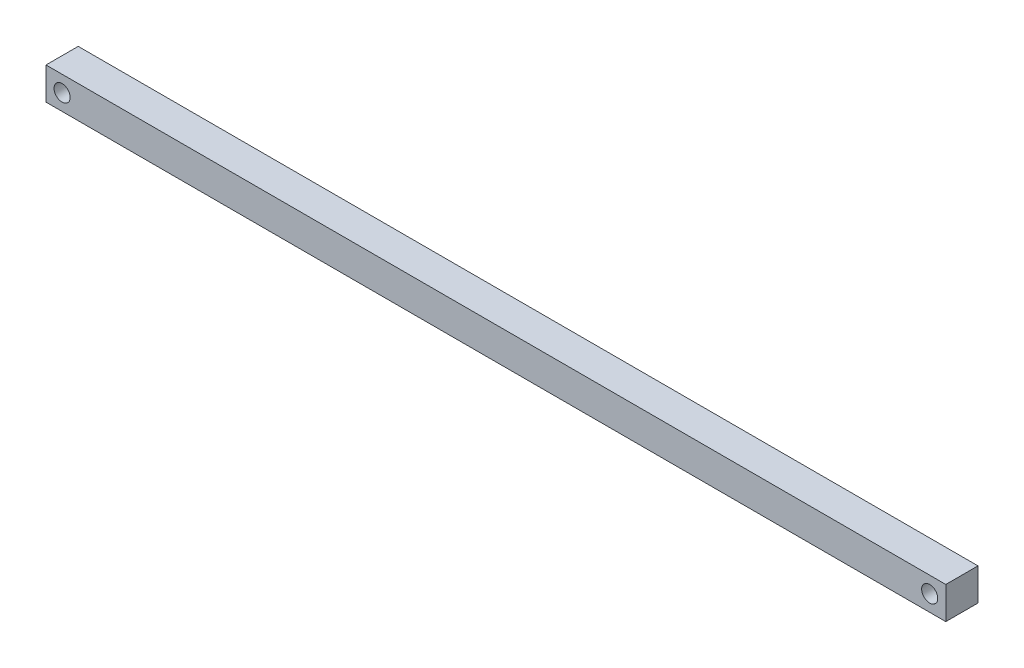
ISO-10303-21;
HEADER;
FILE_DESCRIPTION(('STEP AP214'),'2;1');
FILE_NAME('part.step','',(''),(''),'','','');
FILE_SCHEMA(('AUTOMOTIVE_DESIGN { 1 0 10303 214 1 1 1 1 }'));
ENDSEC;
DATA;
#1=APPLICATION_CONTEXT('core data for automotive mechanical design processes');
#2=APPLICATION_PROTOCOL_DEFINITION('international standard','automotive_design',2000,#1);
#3=PRODUCT_CONTEXT('',#1,'mechanical');
#4=PRODUCT('Part','Part','',(#3));
#5=PRODUCT_RELATED_PRODUCT_CATEGORY('part','',(#4));
#6=PRODUCT_DEFINITION_FORMATION('','',#4);
#7=PRODUCT_DEFINITION_CONTEXT('part definition',#1,'design');
#8=PRODUCT_DEFINITION('design','',#6,#7);
#9=PRODUCT_DEFINITION_SHAPE('','',#8);
#10=(LENGTH_UNIT() NAMED_UNIT(*) SI_UNIT(.MILLI.,.METRE.));
#11=(NAMED_UNIT(*) PLANE_ANGLE_UNIT() SI_UNIT($,.RADIAN.));
#12=(NAMED_UNIT(*) SI_UNIT($,.STERADIAN.) SOLID_ANGLE_UNIT());
#13=UNCERTAINTY_MEASURE_WITH_UNIT(LENGTH_MEASURE(1.E-05),#10,'distance_accuracy_value','');
#14=(GEOMETRIC_REPRESENTATION_CONTEXT(3) GLOBAL_UNCERTAINTY_ASSIGNED_CONTEXT((#13)) GLOBAL_UNIT_ASSIGNED_CONTEXT((#10,
#11,#12)) REPRESENTATION_CONTEXT('',''));
#15=CARTESIAN_POINT('',(0.,0.,0.));
#16=DIRECTION('',(0.,0.,1.));
#17=DIRECTION('',(1.,0.,0.));
#18=AXIS2_PLACEMENT_3D('',#15,#16,#17);
#19=CARTESIAN_POINT('',(0.,0.,15.));
#20=DIRECTION('',(0.,0.,-1.));
#21=DIRECTION('',(-1.,0.,0.));
#22=AXIS2_PLACEMENT_3D('',#19,#20,#21);
#23=PLANE('',#22);
#24=DIRECTION('',(0.,-1.,0.));
#25=VECTOR('',#24,1.);
#26=CARTESIAN_POINT('',(-419.,15.,15.));
#27=LINE('',#26,#25);
#28=CARTESIAN_POINT('',(-419.,15.,15.));
#29=VERTEX_POINT('',#28);
#30=CARTESIAN_POINT('',(-419.,-15.,15.));
#31=VERTEX_POINT('',#30);
#32=EDGE_CURVE('E93',#29,#31,#27,.T.);
#33=ORIENTED_EDGE('',*,*,#32,.T.);
#34=DIRECTION('',(1.,0.,0.));
#35=VECTOR('',#34,1.);
#36=CARTESIAN_POINT('',(419.,-15.,15.));
#37=LINE('',#36,#35);
#38=CARTESIAN_POINT('',(419.,-15.,15.));
#39=VERTEX_POINT('',#38);
#40=EDGE_CURVE('E88',#31,#39,#37,.T.);
#41=ORIENTED_EDGE('',*,*,#40,.T.);
#42=DIRECTION('',(0.,1.,0.));
#43=VECTOR('',#42,1.);
#44=CARTESIAN_POINT('',(419.,15.,15.));
#45=LINE('',#44,#43);
#46=CARTESIAN_POINT('',(419.,15.,15.));
#47=VERTEX_POINT('',#46);
#48=EDGE_CURVE('E91',#39,#47,#45,.T.);
#49=ORIENTED_EDGE('',*,*,#48,.T.);
#50=DIRECTION('',(-1.,0.,0.));
#51=VECTOR('',#50,1.);
#52=CARTESIAN_POINT('',(419.,15.,15.));
#53=LINE('',#52,#51);
#54=EDGE_CURVE('E58',#47,#29,#53,.T.);
#55=ORIENTED_EDGE('',*,*,#54,.T.);
#56=EDGE_LOOP('',(#33,#41,#49,#55));
#57=FACE_BOUND('',#56,.T.);
#58=CARTESIAN_POINT('',(404.,0.,15.));
#59=DIRECTION('',(0.,0.,1.));
#60=DIRECTION('',(1.,0.,0.));
#61=AXIS2_PLACEMENT_3D('',#58,#59,#60);
#62=CIRCLE('',#61,7.50000000000007);
#63=CARTESIAN_POINT('',(411.5,0.,15.));
#64=VERTEX_POINT('',#63);
#65=EDGE_CURVE('E113',#64,#64,#62,.T.);
#66=ORIENTED_EDGE('',*,*,#65,.F.);
#67=EDGE_LOOP('',(#66));
#68=FACE_BOUND('',#67,.T.);
#69=CARTESIAN_POINT('',(-404.,0.,15.));
#70=DIRECTION('',(0.,0.,1.));
#71=DIRECTION('',(1.,0.,0.));
#72=AXIS2_PLACEMENT_3D('',#69,#70,#71);
#73=CIRCLE('',#72,7.50000000000001);
#74=CARTESIAN_POINT('',(-396.5,0.,15.));
#75=VERTEX_POINT('',#74);
#76=EDGE_CURVE('E130',#75,#75,#73,.T.);
#77=ORIENTED_EDGE('',*,*,#76,.F.);
#78=EDGE_LOOP('',(#77));
#79=FACE_BOUND('',#78,.T.);
#80=ADVANCED_FACE('F41',(#57,#68,#79),#23,.F.);
#81=CARTESIAN_POINT('',(0.,0.,-15.));
#82=DIRECTION('',(0.,0.,-1.));
#83=DIRECTION('',(-1.,0.,0.));
#84=AXIS2_PLACEMENT_3D('',#81,#82,#83);
#85=PLANE('',#84);
#86=CARTESIAN_POINT('',(404.,0.,-15.));
#87=DIRECTION('',(0.,0.,1.));
#88=DIRECTION('',(1.,0.,0.));
#89=AXIS2_PLACEMENT_3D('',#86,#87,#88);
#90=CIRCLE('',#89,7.50000000000007);
#91=CARTESIAN_POINT('',(411.5,0.,-15.));
#92=VERTEX_POINT('',#91);
#93=EDGE_CURVE('E127',#92,#92,#90,.T.);
#94=ORIENTED_EDGE('',*,*,#93,.T.);
#95=EDGE_LOOP('',(#94));
#96=FACE_BOUND('',#95,.T.);
#97=DIRECTION('',(0.,-1.,0.));
#98=VECTOR('',#97,1.);
#99=CARTESIAN_POINT('',(-419.,15.,-15.));
#100=LINE('',#99,#98);
#101=CARTESIAN_POINT('',(-419.,15.,-15.));
#102=VERTEX_POINT('',#101);
#103=CARTESIAN_POINT('',(-419.,-15.,-15.));
#104=VERTEX_POINT('',#103);
#105=EDGE_CURVE('E110',#102,#104,#100,.T.);
#106=ORIENTED_EDGE('',*,*,#105,.F.);
#107=DIRECTION('',(-1.,0.,0.));
#108=VECTOR('',#107,1.);
#109=CARTESIAN_POINT('',(419.,15.,-15.));
#110=LINE('',#109,#108);
#111=CARTESIAN_POINT('',(419.,15.,-15.));
#112=VERTEX_POINT('',#111);
#113=EDGE_CURVE('E81',#112,#102,#110,.T.);
#114=ORIENTED_EDGE('',*,*,#113,.F.);
#115=DIRECTION('',(0.,1.,0.));
#116=VECTOR('',#115,1.);
#117=CARTESIAN_POINT('',(419.,15.,-15.));
#118=LINE('',#117,#116);
#119=CARTESIAN_POINT('',(419.,-15.,-15.));
#120=VERTEX_POINT('',#119);
#121=EDGE_CURVE('E75',#120,#112,#118,.T.);
#122=ORIENTED_EDGE('',*,*,#121,.F.);
#123=DIRECTION('',(1.,0.,0.));
#124=VECTOR('',#123,1.);
#125=CARTESIAN_POINT('',(419.,-15.,-15.));
#126=LINE('',#125,#124);
#127=EDGE_CURVE('E98',#104,#120,#126,.T.);
#128=ORIENTED_EDGE('',*,*,#127,.F.);
#129=EDGE_LOOP('',(#106,#114,#122,#128));
#130=FACE_BOUND('',#129,.T.);
#131=CARTESIAN_POINT('',(-404.,0.,-15.));
#132=DIRECTION('',(0.,0.,1.));
#133=DIRECTION('',(1.,0.,0.));
#134=AXIS2_PLACEMENT_3D('',#131,#132,#133);
#135=CIRCLE('',#134,7.50000000000001);
#136=CARTESIAN_POINT('',(-396.5,0.,-15.));
#137=VERTEX_POINT('',#136);
#138=EDGE_CURVE('E134',#137,#137,#135,.T.);
#139=ORIENTED_EDGE('',*,*,#138,.T.);
#140=EDGE_LOOP('',(#139));
#141=FACE_BOUND('',#140,.T.);
#142=ADVANCED_FACE('F123',(#96,#130,#141),#85,.T.);
#143=CARTESIAN_POINT('',(-419.,15.,15.));
#144=DIRECTION('',(1.,0.,0.));
#145=DIRECTION('',(0.,0.,-1.));
#146=AXIS2_PLACEMENT_3D('',#143,#144,#145);
#147=PLANE('',#146);
#148=ORIENTED_EDGE('',*,*,#105,.T.);
#149=DIRECTION('',(0.,0.,-1.));
#150=VECTOR('',#149,1.);
#151=CARTESIAN_POINT('',(-419.,-15.,15.));
#152=LINE('',#151,#150);
#153=EDGE_CURVE('E11',#31,#104,#152,.T.);
#154=ORIENTED_EDGE('',*,*,#153,.F.);
#155=ORIENTED_EDGE('',*,*,#32,.F.);
#156=DIRECTION('',(0.,0.,-1.));
#157=VECTOR('',#156,1.);
#158=CARTESIAN_POINT('',(-419.,15.,15.));
#159=LINE('',#158,#157);
#160=EDGE_CURVE('E106',#29,#102,#159,.T.);
#161=ORIENTED_EDGE('',*,*,#160,.T.);
#162=EDGE_LOOP('',(#148,#154,#155,#161));
#163=FACE_BOUND('',#162,.T.);
#164=ADVANCED_FACE('F43',(#163),#147,.F.);
#165=CARTESIAN_POINT('',(419.,-15.,15.));
#166=DIRECTION('',(0.,1.,0.));
#167=DIRECTION('',(0.,0.,1.));
#168=AXIS2_PLACEMENT_3D('',#165,#166,#167);
#169=PLANE('',#168);
#170=ORIENTED_EDGE('',*,*,#127,.T.);
#171=DIRECTION('',(0.,0.,-1.));
#172=VECTOR('',#171,1.);
#173=CARTESIAN_POINT('',(419.,-15.,15.));
#174=LINE('',#173,#172);
#175=EDGE_CURVE('E50',#39,#120,#174,.T.);
#176=ORIENTED_EDGE('',*,*,#175,.F.);
#177=ORIENTED_EDGE('',*,*,#40,.F.);
#178=ORIENTED_EDGE('',*,*,#153,.T.);
#179=EDGE_LOOP('',(#170,#176,#177,#178));
#180=FACE_BOUND('',#179,.T.);
#181=ADVANCED_FACE('F97',(#180),#169,.F.);
#182=CARTESIAN_POINT('',(419.,15.,15.));
#183=DIRECTION('',(-1.,0.,0.));
#184=DIRECTION('',(0.,0.,1.));
#185=AXIS2_PLACEMENT_3D('',#182,#183,#184);
#186=PLANE('',#185);
#187=ORIENTED_EDGE('',*,*,#121,.T.);
#188=DIRECTION('',(0.,0.,-1.));
#189=VECTOR('',#188,1.);
#190=CARTESIAN_POINT('',(419.,15.,15.));
#191=LINE('',#190,#189);
#192=EDGE_CURVE('E99',#47,#112,#191,.T.);
#193=ORIENTED_EDGE('',*,*,#192,.F.);
#194=ORIENTED_EDGE('',*,*,#48,.F.);
#195=ORIENTED_EDGE('',*,*,#175,.T.);
#196=EDGE_LOOP('',(#187,#193,#194,#195));
#197=FACE_BOUND('',#196,.T.);
#198=ADVANCED_FACE('F100',(#197),#186,.F.);
#199=CARTESIAN_POINT('',(419.,15.,15.));
#200=DIRECTION('',(0.,-1.,0.));
#201=DIRECTION('',(0.,0.,-1.));
#202=AXIS2_PLACEMENT_3D('',#199,#200,#201);
#203=PLANE('',#202);
#204=ORIENTED_EDGE('',*,*,#113,.T.);
#205=ORIENTED_EDGE('',*,*,#160,.F.);
#206=ORIENTED_EDGE('',*,*,#54,.F.);
#207=ORIENTED_EDGE('',*,*,#192,.T.);
#208=EDGE_LOOP('',(#204,#205,#206,#207));
#209=FACE_BOUND('',#208,.T.);
#210=ADVANCED_FACE('F120',(#209),#203,.F.);
#211=CARTESIAN_POINT('',(404.,0.,15.));
#212=DIRECTION('',(0.,0.,-1.));
#213=DIRECTION('',(-1.,0.,0.));
#214=AXIS2_PLACEMENT_3D('',#211,#212,#213);
#215=CYLINDRICAL_SURFACE('',#214,7.50000000000007);
#216=ORIENTED_EDGE('',*,*,#65,.T.);
#217=EDGE_LOOP('',(#216));
#218=FACE_BOUND('',#217,.T.);
#219=ORIENTED_EDGE('',*,*,#93,.F.);
#220=EDGE_LOOP('',(#219));
#221=FACE_BOUND('',#220,.T.);
#222=ADVANCED_FACE('F151',(#218,#221),#215,.F.);
#223=CARTESIAN_POINT('',(-404.,0.,15.));
#224=DIRECTION('',(0.,0.,-1.));
#225=DIRECTION('',(-1.,0.,0.));
#226=AXIS2_PLACEMENT_3D('',#223,#224,#225);
#227=CYLINDRICAL_SURFACE('',#226,7.50000000000001);
#228=ORIENTED_EDGE('',*,*,#76,.T.);
#229=EDGE_LOOP('',(#228));
#230=FACE_BOUND('',#229,.T.);
#231=ORIENTED_EDGE('',*,*,#138,.F.);
#232=EDGE_LOOP('',(#231));
#233=FACE_BOUND('',#232,.T.);
#234=ADVANCED_FACE('F140',(#230,#233),#227,.F.);
#235=CLOSED_SHELL('',(#80,#142,#164,#181,#198,#210,#222,#234));
#236=MANIFOLD_SOLID_BREP('B2',#235);
#237=ADVANCED_BREP_SHAPE_REPRESENTATION('',(#18,#236),#14);
#238=SHAPE_DEFINITION_REPRESENTATION(#9,#237);
ENDSEC;
END-ISO-10303-21;
